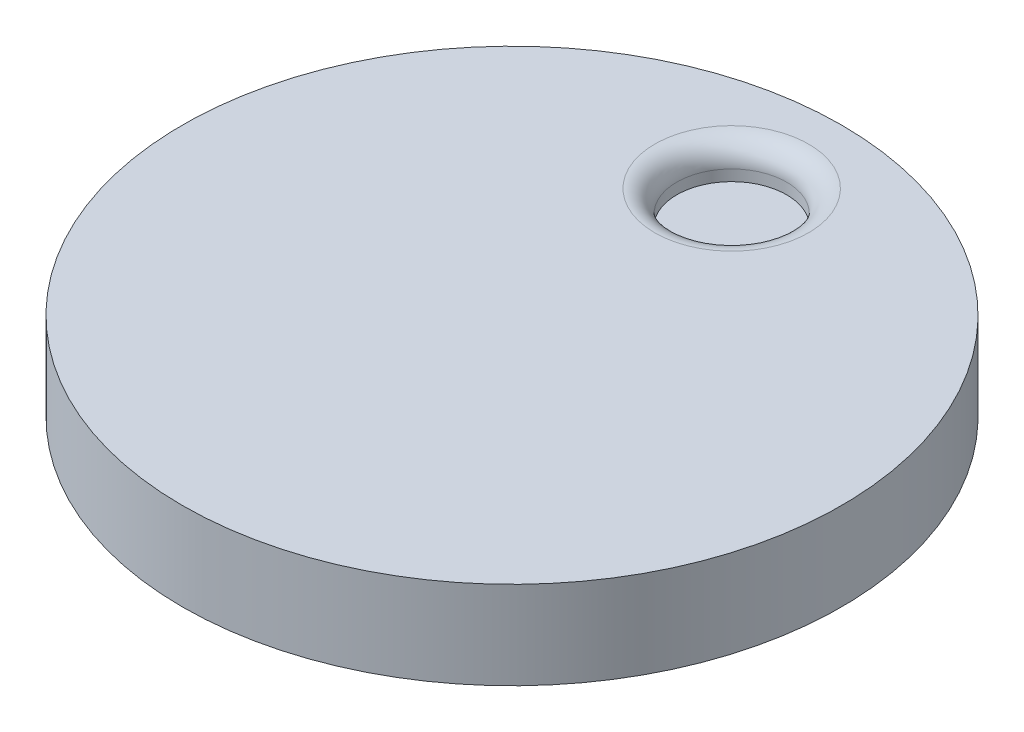
ISO-10303-21;
HEADER;
FILE_DESCRIPTION(('STEP AP214'),'2;1');
FILE_NAME('part.step','',(''),(''),'','','');
FILE_SCHEMA(('AUTOMOTIVE_DESIGN { 1 0 10303 214 1 1 1 1 }'));
ENDSEC;
DATA;
#1=APPLICATION_CONTEXT('core data for automotive mechanical design processes');
#2=APPLICATION_PROTOCOL_DEFINITION('international standard','automotive_design',2000,#1);
#3=PRODUCT_CONTEXT('',#1,'mechanical');
#4=PRODUCT('Part','Part','',(#3));
#5=PRODUCT_RELATED_PRODUCT_CATEGORY('part','',(#4));
#6=PRODUCT_DEFINITION_FORMATION('','',#4);
#7=PRODUCT_DEFINITION_CONTEXT('part definition',#1,'design');
#8=PRODUCT_DEFINITION('design','',#6,#7);
#9=PRODUCT_DEFINITION_SHAPE('','',#8);
#10=(LENGTH_UNIT() NAMED_UNIT(*) SI_UNIT(.MILLI.,.METRE.));
#11=(NAMED_UNIT(*) PLANE_ANGLE_UNIT() SI_UNIT($,.RADIAN.));
#12=(NAMED_UNIT(*) SI_UNIT($,.STERADIAN.) SOLID_ANGLE_UNIT());
#13=UNCERTAINTY_MEASURE_WITH_UNIT(LENGTH_MEASURE(1.E-05),#10,'distance_accuracy_value','');
#14=(GEOMETRIC_REPRESENTATION_CONTEXT(3) GLOBAL_UNCERTAINTY_ASSIGNED_CONTEXT((#13)) GLOBAL_UNIT_ASSIGNED_CONTEXT((#10,
#11,#12)) REPRESENTATION_CONTEXT('',''));
#15=CARTESIAN_POINT('',(0.,0.,0.));
#16=DIRECTION('',(0.,0.,1.));
#17=DIRECTION('',(1.,0.,0.));
#18=AXIS2_PLACEMENT_3D('',#15,#16,#17);
#19=CARTESIAN_POINT('',(0.,8.,0.));
#20=DIRECTION('',(0.,-1.,0.));
#21=DIRECTION('',(0.,0.,-1.));
#22=AXIS2_PLACEMENT_3D('',#19,#20,#21);
#23=CYLINDRICAL_SURFACE('',#22,30.);
#24=CARTESIAN_POINT('',(0.,8.,0.));
#25=DIRECTION('',(0.,1.,0.));
#26=DIRECTION('',(0.,0.,1.));
#27=AXIS2_PLACEMENT_3D('',#24,#25,#26);
#28=CIRCLE('',#27,30.);
#29=CARTESIAN_POINT('',(0.,8.,30.));
#30=VERTEX_POINT('',#29);
#31=EDGE_CURVE('E42',#30,#30,#28,.T.);
#32=ORIENTED_EDGE('',*,*,#31,.F.);
#33=EDGE_LOOP('',(#32));
#34=FACE_BOUND('',#33,.T.);
#35=CARTESIAN_POINT('',(0.,0.,0.));
#36=DIRECTION('',(0.,1.,0.));
#37=DIRECTION('',(0.,0.,1.));
#38=AXIS2_PLACEMENT_3D('',#35,#36,#37);
#39=CIRCLE('',#38,30.);
#40=CARTESIAN_POINT('',(0.,0.,30.));
#41=VERTEX_POINT('',#40);
#42=EDGE_CURVE('E46',#41,#41,#39,.T.);
#43=ORIENTED_EDGE('',*,*,#42,.T.);
#44=EDGE_LOOP('',(#43));
#45=FACE_BOUND('',#44,.T.);
#46=ADVANCED_FACE('F31',(#34,#45),#23,.T.);
#47=CARTESIAN_POINT('',(0.,8.,0.));
#48=DIRECTION('',(0.,1.,0.));
#49=DIRECTION('',(0.,0.,1.));
#50=AXIS2_PLACEMENT_3D('',#47,#48,#49);
#51=PLANE('',#50);
#52=CARTESIAN_POINT('',(0.,8.,-20.));
#53=DIRECTION('',(0.,1.,0.));
#54=DIRECTION('',(0.,0.,1.));
#55=AXIS2_PLACEMENT_3D('',#52,#53,#54);
#56=CIRCLE('',#55,7.);
#57=CARTESIAN_POINT('',(0.,8.,-13.));
#58=VERTEX_POINT('',#57);
#59=EDGE_CURVE('E10',#58,#58,#56,.F.);
#60=ORIENTED_EDGE('',*,*,#59,.T.);
#61=EDGE_LOOP('',(#60));
#62=FACE_BOUND('',#61,.T.);
#63=ORIENTED_EDGE('',*,*,#31,.T.);
#64=EDGE_LOOP('',(#63));
#65=FACE_BOUND('',#64,.T.);
#66=ADVANCED_FACE('F66',(#62,#65),#51,.T.);
#67=CARTESIAN_POINT('',(0.,0.,0.));
#68=DIRECTION('',(0.,1.,0.));
#69=DIRECTION('',(0.,0.,1.));
#70=AXIS2_PLACEMENT_3D('',#67,#68,#69);
#71=PLANE('',#70);
#72=ORIENTED_EDGE('',*,*,#42,.F.);
#73=EDGE_LOOP('',(#72));
#74=FACE_BOUND('',#73,.T.);
#75=ADVANCED_FACE('F59',(#74),#71,.F.);
#76=CARTESIAN_POINT('',(0.,5.,-20.));
#77=DIRECTION('',(0.,1.,0.));
#78=DIRECTION('',(0.,0.,1.));
#79=AXIS2_PLACEMENT_3D('',#76,#77,#78);
#80=CYLINDRICAL_SURFACE('',#79,5.);
#81=CARTESIAN_POINT('',(0.,6.,-20.));
#82=DIRECTION('',(0.,1.,0.));
#83=DIRECTION('',(0.,0.,1.));
#84=AXIS2_PLACEMENT_3D('',#81,#82,#83);
#85=CIRCLE('',#84,5.);
#86=CARTESIAN_POINT('',(0.,6.,-15.));
#87=VERTEX_POINT('',#86);
#88=EDGE_CURVE('E38',#87,#87,#85,.T.);
#89=ORIENTED_EDGE('',*,*,#88,.T.);
#90=EDGE_LOOP('',(#89));
#91=FACE_BOUND('',#90,.T.);
#92=CARTESIAN_POINT('',(0.,5.,-20.));
#93=DIRECTION('',(0.,1.,0.));
#94=DIRECTION('',(0.,0.,1.));
#95=AXIS2_PLACEMENT_3D('',#92,#93,#94);
#96=CIRCLE('',#95,5.);
#97=CARTESIAN_POINT('',(0.,5.,-15.));
#98=VERTEX_POINT('',#97);
#99=EDGE_CURVE('E50',#98,#98,#96,.T.);
#100=ORIENTED_EDGE('',*,*,#99,.F.);
#101=EDGE_LOOP('',(#100));
#102=FACE_BOUND('',#101,.T.);
#103=ADVANCED_FACE('F57',(#91,#102),#80,.F.);
#104=CARTESIAN_POINT('',(0.,5.,-20.));
#105=DIRECTION('',(0.,1.,0.));
#106=DIRECTION('',(0.,0.,1.));
#107=AXIS2_PLACEMENT_3D('',#104,#105,#106);
#108=PLANE('',#107);
#109=ORIENTED_EDGE('',*,*,#99,.T.);
#110=EDGE_LOOP('',(#109));
#111=FACE_BOUND('',#110,.T.);
#112=ADVANCED_FACE('F55',(#111),#108,.T.);
#113=CARTESIAN_POINT('',(0.,6.,-20.));
#114=DIRECTION('',(0.,1.,0.));
#115=DIRECTION('',(0.,0.,1.));
#116=AXIS2_PLACEMENT_3D('',#113,#114,#115);
#117=TOROIDAL_SURFACE('',#116,7.,2.);
#118=ORIENTED_EDGE('',*,*,#59,.F.);
#119=EDGE_LOOP('',(#118));
#120=FACE_BOUND('',#119,.T.);
#121=ORIENTED_EDGE('',*,*,#88,.F.);
#122=EDGE_LOOP('',(#121));
#123=FACE_BOUND('',#122,.T.);
#124=ADVANCED_FACE('F33',(#120,#123),#117,.T.);
#125=CLOSED_SHELL('',(#46,#66,#75,#103,#112,#124));
#126=MANIFOLD_SOLID_BREP('B2',#125);
#127=ADVANCED_BREP_SHAPE_REPRESENTATION('',(#18,#126),#14);
#128=SHAPE_DEFINITION_REPRESENTATION(#9,#127);
ENDSEC;
END-ISO-10303-21;
